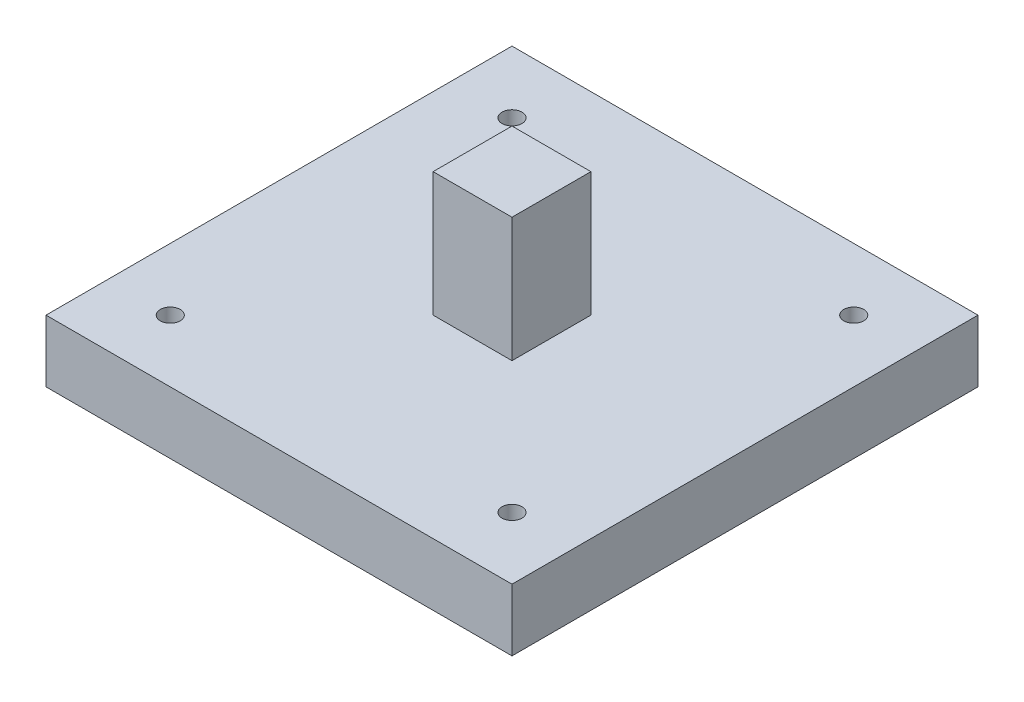
ISO-10303-21;
HEADER;
FILE_DESCRIPTION(('STEP AP214'),'2;1');
FILE_NAME('part.step','',(''),(''),'','','');
FILE_SCHEMA(('AUTOMOTIVE_DESIGN { 1 0 10303 214 1 1 1 1 }'));
ENDSEC;
DATA;
#1=APPLICATION_CONTEXT('core data for automotive mechanical design processes');
#2=APPLICATION_PROTOCOL_DEFINITION('international standard','automotive_design',2000,#1);
#3=PRODUCT_CONTEXT('',#1,'mechanical');
#4=PRODUCT('Part','Part','',(#3));
#5=PRODUCT_RELATED_PRODUCT_CATEGORY('part','',(#4));
#6=PRODUCT_DEFINITION_FORMATION('','',#4);
#7=PRODUCT_DEFINITION_CONTEXT('part definition',#1,'design');
#8=PRODUCT_DEFINITION('design','',#6,#7);
#9=PRODUCT_DEFINITION_SHAPE('','',#8);
#10=(LENGTH_UNIT() NAMED_UNIT(*) SI_UNIT(.MILLI.,.METRE.));
#11=(NAMED_UNIT(*) PLANE_ANGLE_UNIT() SI_UNIT($,.RADIAN.));
#12=(NAMED_UNIT(*) SI_UNIT($,.STERADIAN.) SOLID_ANGLE_UNIT());
#13=UNCERTAINTY_MEASURE_WITH_UNIT(LENGTH_MEASURE(1.E-05),#10,'distance_accuracy_value','');
#14=(GEOMETRIC_REPRESENTATION_CONTEXT(3) GLOBAL_UNCERTAINTY_ASSIGNED_CONTEXT((#13)) GLOBAL_UNIT_ASSIGNED_CONTEXT((#10,
#11,#12)) REPRESENTATION_CONTEXT('',''));
#15=CARTESIAN_POINT('',(0.,0.,0.));
#16=DIRECTION('',(0.,0.,1.));
#17=DIRECTION('',(1.,0.,0.));
#18=AXIS2_PLACEMENT_3D('',#15,#16,#17);
#19=CARTESIAN_POINT('',(0.,10.,0.));
#20=DIRECTION('',(0.,1.,0.));
#21=DIRECTION('',(0.,0.,1.));
#22=AXIS2_PLACEMENT_3D('',#19,#20,#21);
#23=PLANE('',#22);
#24=CARTESIAN_POINT('',(29.7613065326633,10.,-19.2085427135678));
#25=DIRECTION('',(0.,1.,0.));
#26=DIRECTION('',(0.,0.,1.));
#27=AXIS2_PLACEMENT_3D('',#24,#25,#26);
#28=CIRCLE('',#27,1.6);
#29=CARTESIAN_POINT('',(29.7613065326633,10.,-17.6085427135679));
#30=VERTEX_POINT('',#29);
#31=EDGE_CURVE('E151',#30,#30,#28,.T.);
#32=ORIENTED_EDGE('',*,*,#31,.F.);
#33=EDGE_LOOP('',(#32));
#34=FACE_BOUND('',#33,.T.);
#35=CARTESIAN_POINT('',(-25.2386934673367,10.,35.7914572864321));
#36=DIRECTION('',(0.,1.,0.));
#37=DIRECTION('',(0.,0.,1.));
#38=AXIS2_PLACEMENT_3D('',#35,#36,#37);
#39=CIRCLE('',#38,1.6);
#40=CARTESIAN_POINT('',(-25.2386934673367,10.,37.3914572864321));
#41=VERTEX_POINT('',#40);
#42=EDGE_CURVE('E160',#41,#41,#39,.T.);
#43=ORIENTED_EDGE('',*,*,#42,.F.);
#44=EDGE_LOOP('',(#43));
#45=FACE_BOUND('',#44,.T.);
#46=CARTESIAN_POINT('',(29.7613065326633,10.,35.7914572864321));
#47=DIRECTION('',(0.,1.,0.));
#48=DIRECTION('',(0.,0.,1.));
#49=AXIS2_PLACEMENT_3D('',#46,#47,#48);
#50=CIRCLE('',#49,1.6);
#51=CARTESIAN_POINT('',(29.7613065326633,10.,37.3914572864321));
#52=VERTEX_POINT('',#51);
#53=EDGE_CURVE('E141',#52,#52,#50,.T.);
#54=ORIENTED_EDGE('',*,*,#53,.F.);
#55=EDGE_LOOP('',(#54));
#56=FACE_BOUND('',#55,.T.);
#57=CARTESIAN_POINT('',(-25.2386934673367,10.,-19.2085427135678));
#58=DIRECTION('',(0.,1.,0.));
#59=DIRECTION('',(0.,0.,1.));
#60=AXIS2_PLACEMENT_3D('',#57,#58,#59);
#61=CIRCLE('',#60,1.6);
#62=CARTESIAN_POINT('',(-25.2386934673367,10.,-17.6085427135678));
#63=VERTEX_POINT('',#62);
#64=EDGE_CURVE('E155',#63,#63,#61,.T.);
#65=ORIENTED_EDGE('',*,*,#64,.F.);
#66=EDGE_LOOP('',(#65));
#67=FACE_BOUND('',#66,.T.);
#68=DIRECTION('',(0.,0.,1.));
#69=VECTOR('',#68,1.);
#70=CARTESIAN_POINT('',(-35.2386934673367,10.,-29.2085427135678));
#71=LINE('',#70,#69);
#72=CARTESIAN_POINT('',(-35.2386934673367,10.,-29.2085427135678));
#73=VERTEX_POINT('',#72);
#74=CARTESIAN_POINT('',(-35.2386934673367,10.,45.7914572864321));
#75=VERTEX_POINT('',#74);
#76=EDGE_CURVE('E175',#73,#75,#71,.T.);
#77=ORIENTED_EDGE('',*,*,#76,.T.);
#78=DIRECTION('',(1.,0.,0.));
#79=VECTOR('',#78,1.);
#80=CARTESIAN_POINT('',(-35.2386934673367,10.,45.7914572864321));
#81=LINE('',#80,#79);
#82=CARTESIAN_POINT('',(39.7613065326633,10.,45.7914572864321));
#83=VERTEX_POINT('',#82);
#84=EDGE_CURVE('E179',#75,#83,#81,.T.);
#85=ORIENTED_EDGE('',*,*,#84,.T.);
#86=DIRECTION('',(0.,0.,-1.));
#87=VECTOR('',#86,1.);
#88=CARTESIAN_POINT('',(39.7613065326633,10.,-29.2085427135678));
#89=LINE('',#88,#87);
#90=CARTESIAN_POINT('',(39.7613065326633,10.,-29.2085427135678));
#91=VERTEX_POINT('',#90);
#92=EDGE_CURVE('E183',#83,#91,#89,.T.);
#93=ORIENTED_EDGE('',*,*,#92,.T.);
#94=DIRECTION('',(-1.,0.,0.));
#95=VECTOR('',#94,1.);
#96=CARTESIAN_POINT('',(-35.2386934673367,10.,-29.2085427135678));
#97=LINE('',#96,#95);
#98=EDGE_CURVE('E186',#91,#73,#97,.T.);
#99=ORIENTED_EDGE('',*,*,#98,.T.);
#100=EDGE_LOOP('',(#77,#85,#93,#99));
#101=FACE_BOUND('',#100,.T.);
#102=DIRECTION('',(1.,0.,0.));
#103=VECTOR('',#102,1.);
#104=CARTESIAN_POINT('',(-4.08869346733667,10.,14.6414572864321));
#105=LINE('',#104,#103);
#106=CARTESIAN_POINT('',(-4.08869346733667,10.,14.6414572864321));
#107=VERTEX_POINT('',#106);
#108=CARTESIAN_POINT('',(8.61130653266333,10.,14.6414572864321));
#109=VERTEX_POINT('',#108);
#110=EDGE_CURVE('E61',#107,#109,#105,.T.);
#111=ORIENTED_EDGE('',*,*,#110,.F.);
#112=DIRECTION('',(0.,0.,1.));
#113=VECTOR('',#112,1.);
#114=CARTESIAN_POINT('',(-4.08869346733667,10.,1.94145728643215));
#115=LINE('',#114,#113);
#116=CARTESIAN_POINT('',(-4.08869346733667,10.,1.94145728643215));
#117=VERTEX_POINT('',#116);
#118=EDGE_CURVE('E134',#117,#107,#115,.T.);
#119=ORIENTED_EDGE('',*,*,#118,.F.);
#120=DIRECTION('',(1.,0.,0.));
#121=VECTOR('',#120,1.);
#122=CARTESIAN_POINT('',(-4.08869346733667,10.,1.94145728643215));
#123=LINE('',#122,#121);
#124=CARTESIAN_POINT('',(8.61130653266333,10.,1.94145728643215));
#125=VERTEX_POINT('',#124);
#126=EDGE_CURVE('E131',#117,#125,#123,.T.);
#127=ORIENTED_EDGE('',*,*,#126,.T.);
#128=DIRECTION('',(0.,0.,1.));
#129=VECTOR('',#128,1.);
#130=CARTESIAN_POINT('',(8.61130653266333,10.,1.94145728643215));
#131=LINE('',#130,#129);
#132=EDGE_CURVE('E66',#125,#109,#131,.T.);
#133=ORIENTED_EDGE('',*,*,#132,.T.);
#134=EDGE_LOOP('',(#111,#119,#127,#133));
#135=FACE_BOUND('',#134,.T.);
#136=ADVANCED_FACE('F45',(#34,#45,#56,#67,#101,#135),#23,.T.);
#137=CARTESIAN_POINT('',(-35.2386934673367,10.,-29.2085427135678));
#138=DIRECTION('',(1.,0.,0.));
#139=DIRECTION('',(0.,0.,-1.));
#140=AXIS2_PLACEMENT_3D('',#137,#138,#139);
#141=PLANE('',#140);
#142=DIRECTION('',(0.,0.,1.));
#143=VECTOR('',#142,1.);
#144=CARTESIAN_POINT('',(-35.2386934673367,0.,-29.2085427135678));
#145=LINE('',#144,#143);
#146=CARTESIAN_POINT('',(-35.2386934673367,0.,-29.2085427135678));
#147=VERTEX_POINT('',#146);
#148=CARTESIAN_POINT('',(-35.2386934673367,0.,45.7914572864321));
#149=VERTEX_POINT('',#148);
#150=EDGE_CURVE('E171',#147,#149,#145,.T.);
#151=ORIENTED_EDGE('',*,*,#150,.T.);
#152=DIRECTION('',(0.,-1.,0.));
#153=VECTOR('',#152,1.);
#154=CARTESIAN_POINT('',(-35.2386934673367,10.,45.7914572864321));
#155=LINE('',#154,#153);
#156=EDGE_CURVE('E11',#75,#149,#155,.T.);
#157=ORIENTED_EDGE('',*,*,#156,.F.);
#158=ORIENTED_EDGE('',*,*,#76,.F.);
#159=DIRECTION('',(0.,-1.,0.));
#160=VECTOR('',#159,1.);
#161=CARTESIAN_POINT('',(-35.2386934673367,10.,-29.2085427135678));
#162=LINE('',#161,#160);
#163=EDGE_CURVE('E189',#73,#147,#162,.T.);
#164=ORIENTED_EDGE('',*,*,#163,.T.);
#165=EDGE_LOOP('',(#151,#157,#158,#164));
#166=FACE_BOUND('',#165,.T.);
#167=ADVANCED_FACE('F47',(#166),#141,.F.);
#168=CARTESIAN_POINT('',(-35.2386934673367,10.,45.7914572864321));
#169=DIRECTION('',(0.,0.,-1.));
#170=DIRECTION('',(-1.,0.,0.));
#171=AXIS2_PLACEMENT_3D('',#168,#169,#170);
#172=PLANE('',#171);
#173=DIRECTION('',(1.,0.,0.));
#174=VECTOR('',#173,1.);
#175=CARTESIAN_POINT('',(-35.2386934673367,0.,45.7914572864321));
#176=LINE('',#175,#174);
#177=CARTESIAN_POINT('',(39.7613065326633,0.,45.7914572864321));
#178=VERTEX_POINT('',#177);
#179=EDGE_CURVE('E193',#149,#178,#176,.T.);
#180=ORIENTED_EDGE('',*,*,#179,.T.);
#181=DIRECTION('',(0.,-1.,0.));
#182=VECTOR('',#181,1.);
#183=CARTESIAN_POINT('',(39.7613065326633,10.,45.7914572864321));
#184=LINE('',#183,#182);
#185=EDGE_CURVE('E54',#83,#178,#184,.T.);
#186=ORIENTED_EDGE('',*,*,#185,.F.);
#187=ORIENTED_EDGE('',*,*,#84,.F.);
#188=ORIENTED_EDGE('',*,*,#156,.T.);
#189=EDGE_LOOP('',(#180,#186,#187,#188));
#190=FACE_BOUND('',#189,.T.);
#191=ADVANCED_FACE('F228',(#190),#172,.F.);
#192=CARTESIAN_POINT('',(39.7613065326633,10.,-29.2085427135678));
#193=DIRECTION('',(-1.,0.,0.));
#194=DIRECTION('',(0.,0.,1.));
#195=AXIS2_PLACEMENT_3D('',#192,#193,#194);
#196=PLANE('',#195);
#197=DIRECTION('',(0.,0.,-1.));
#198=VECTOR('',#197,1.);
#199=CARTESIAN_POINT('',(39.7613065326633,0.,-29.2085427135678));
#200=LINE('',#199,#198);
#201=CARTESIAN_POINT('',(39.7613065326633,0.,-29.2085427135678));
#202=VERTEX_POINT('',#201);
#203=EDGE_CURVE('E196',#178,#202,#200,.T.);
#204=ORIENTED_EDGE('',*,*,#203,.T.);
#205=DIRECTION('',(0.,-1.,0.));
#206=VECTOR('',#205,1.);
#207=CARTESIAN_POINT('',(39.7613065326633,10.,-29.2085427135678));
#208=LINE('',#207,#206);
#209=EDGE_CURVE('E204',#91,#202,#208,.T.);
#210=ORIENTED_EDGE('',*,*,#209,.F.);
#211=ORIENTED_EDGE('',*,*,#92,.F.);
#212=ORIENTED_EDGE('',*,*,#185,.T.);
#213=EDGE_LOOP('',(#204,#210,#211,#212));
#214=FACE_BOUND('',#213,.T.);
#215=ADVANCED_FACE('F213',(#214),#196,.F.);
#216=CARTESIAN_POINT('',(-35.2386934673367,10.,-29.2085427135678));
#217=DIRECTION('',(0.,0.,1.));
#218=DIRECTION('',(1.,0.,0.));
#219=AXIS2_PLACEMENT_3D('',#216,#217,#218);
#220=PLANE('',#219);
#221=DIRECTION('',(-1.,0.,0.));
#222=VECTOR('',#221,1.);
#223=CARTESIAN_POINT('',(-35.2386934673367,0.,-29.2085427135678));
#224=LINE('',#223,#222);
#225=EDGE_CURVE('E180',#202,#147,#224,.T.);
#226=ORIENTED_EDGE('',*,*,#225,.T.);
#227=ORIENTED_EDGE('',*,*,#163,.F.);
#228=ORIENTED_EDGE('',*,*,#98,.F.);
#229=ORIENTED_EDGE('',*,*,#209,.T.);
#230=EDGE_LOOP('',(#226,#227,#228,#229));
#231=FACE_BOUND('',#230,.T.);
#232=ADVANCED_FACE('F222',(#231),#220,.F.);
#233=CARTESIAN_POINT('',(0.,0.,0.));
#234=DIRECTION('',(0.,1.,0.));
#235=DIRECTION('',(0.,0.,1.));
#236=AXIS2_PLACEMENT_3D('',#233,#234,#235);
#237=PLANE('',#236);
#238=CARTESIAN_POINT('',(29.7613065326633,0.,-19.2085427135678));
#239=DIRECTION('',(0.,1.,0.));
#240=DIRECTION('',(0.,0.,1.));
#241=AXIS2_PLACEMENT_3D('',#238,#239,#240);
#242=CIRCLE('',#241,1.6);
#243=CARTESIAN_POINT('',(29.7613065326633,0.,-17.6085427135679));
#244=VERTEX_POINT('',#243);
#245=EDGE_CURVE('E156',#244,#244,#242,.T.);
#246=ORIENTED_EDGE('',*,*,#245,.T.);
#247=EDGE_LOOP('',(#246));
#248=FACE_BOUND('',#247,.T.);
#249=CARTESIAN_POINT('',(-25.2386934673367,0.,35.7914572864321));
#250=DIRECTION('',(0.,1.,0.));
#251=DIRECTION('',(0.,0.,1.));
#252=AXIS2_PLACEMENT_3D('',#249,#250,#251);
#253=CIRCLE('',#252,1.6);
#254=CARTESIAN_POINT('',(-25.2386934673367,0.,37.3914572864321));
#255=VERTEX_POINT('',#254);
#256=EDGE_CURVE('E149',#255,#255,#253,.T.);
#257=ORIENTED_EDGE('',*,*,#256,.T.);
#258=EDGE_LOOP('',(#257));
#259=FACE_BOUND('',#258,.T.);
#260=CARTESIAN_POINT('',(29.7613065326633,0.,35.7914572864321));
#261=DIRECTION('',(0.,1.,0.));
#262=DIRECTION('',(0.,0.,1.));
#263=AXIS2_PLACEMENT_3D('',#260,#261,#262);
#264=CIRCLE('',#263,1.6);
#265=CARTESIAN_POINT('',(29.7613065326633,0.,37.3914572864321));
#266=VERTEX_POINT('',#265);
#267=EDGE_CURVE('E136',#266,#266,#264,.T.);
#268=ORIENTED_EDGE('',*,*,#267,.T.);
#269=EDGE_LOOP('',(#268));
#270=FACE_BOUND('',#269,.T.);
#271=CARTESIAN_POINT('',(-25.2386934673367,0.,-19.2085427135678));
#272=DIRECTION('',(0.,1.,0.));
#273=DIRECTION('',(0.,0.,1.));
#274=AXIS2_PLACEMENT_3D('',#271,#272,#273);
#275=CIRCLE('',#274,1.6);
#276=CARTESIAN_POINT('',(-25.2386934673367,0.,-17.6085427135678));
#277=VERTEX_POINT('',#276);
#278=EDGE_CURVE('E167',#277,#277,#275,.T.);
#279=ORIENTED_EDGE('',*,*,#278,.T.);
#280=EDGE_LOOP('',(#279));
#281=FACE_BOUND('',#280,.T.);
#282=ORIENTED_EDGE('',*,*,#150,.F.);
#283=ORIENTED_EDGE('',*,*,#225,.F.);
#284=ORIENTED_EDGE('',*,*,#203,.F.);
#285=ORIENTED_EDGE('',*,*,#179,.F.);
#286=EDGE_LOOP('',(#282,#283,#284,#285));
#287=FACE_BOUND('',#286,.T.);
#288=ADVANCED_FACE('F219',(#248,#259,#270,#281,#287),#237,.F.);
#289=CARTESIAN_POINT('',(-25.2386934673367,0.,-19.2085427135678));
#290=DIRECTION('',(0.,1.,0.));
#291=DIRECTION('',(0.,0.,1.));
#292=AXIS2_PLACEMENT_3D('',#289,#290,#291);
#293=CYLINDRICAL_SURFACE('',#292,1.6);
#294=ORIENTED_EDGE('',*,*,#278,.F.);
#295=EDGE_LOOP('',(#294));
#296=FACE_BOUND('',#295,.T.);
#297=ORIENTED_EDGE('',*,*,#64,.T.);
#298=EDGE_LOOP('',(#297));
#299=FACE_BOUND('',#298,.T.);
#300=ADVANCED_FACE('F244',(#296,#299),#293,.F.);
#301=CARTESIAN_POINT('',(29.7613065326633,0.,35.7914572864321));
#302=DIRECTION('',(0.,1.,0.));
#303=DIRECTION('',(0.,0.,1.));
#304=AXIS2_PLACEMENT_3D('',#301,#302,#303);
#305=CYLINDRICAL_SURFACE('',#304,1.6);
#306=ORIENTED_EDGE('',*,*,#267,.F.);
#307=EDGE_LOOP('',(#306));
#308=FACE_BOUND('',#307,.T.);
#309=ORIENTED_EDGE('',*,*,#53,.T.);
#310=EDGE_LOOP('',(#309));
#311=FACE_BOUND('',#310,.T.);
#312=ADVANCED_FACE('F264',(#308,#311),#305,.F.);
#313=CARTESIAN_POINT('',(-25.2386934673367,0.,35.7914572864321));
#314=DIRECTION('',(0.,1.,0.));
#315=DIRECTION('',(0.,0.,1.));
#316=AXIS2_PLACEMENT_3D('',#313,#314,#315);
#317=CYLINDRICAL_SURFACE('',#316,1.6);
#318=ORIENTED_EDGE('',*,*,#256,.F.);
#319=EDGE_LOOP('',(#318));
#320=FACE_BOUND('',#319,.T.);
#321=ORIENTED_EDGE('',*,*,#42,.T.);
#322=EDGE_LOOP('',(#321));
#323=FACE_BOUND('',#322,.T.);
#324=ADVANCED_FACE('F271',(#320,#323),#317,.F.);
#325=CARTESIAN_POINT('',(29.7613065326633,0.,-19.2085427135678));
#326=DIRECTION('',(0.,1.,0.));
#327=DIRECTION('',(0.,0.,1.));
#328=AXIS2_PLACEMENT_3D('',#325,#326,#327);
#329=CYLINDRICAL_SURFACE('',#328,1.6);
#330=ORIENTED_EDGE('',*,*,#245,.F.);
#331=EDGE_LOOP('',(#330));
#332=FACE_BOUND('',#331,.T.);
#333=ORIENTED_EDGE('',*,*,#31,.T.);
#334=EDGE_LOOP('',(#333));
#335=FACE_BOUND('',#334,.T.);
#336=ADVANCED_FACE('F279',(#332,#335),#329,.F.);
#337=CARTESIAN_POINT('',(-4.08869346733667,30.,1.94145728643215));
#338=DIRECTION('',(1.,0.,0.));
#339=DIRECTION('',(0.,0.,-1.));
#340=AXIS2_PLACEMENT_3D('',#337,#338,#339);
#341=PLANE('',#340);
#342=ORIENTED_EDGE('',*,*,#118,.T.);
#343=DIRECTION('',(0.,-1.,0.));
#344=VECTOR('',#343,1.);
#345=CARTESIAN_POINT('',(-4.08869346733667,30.,14.6414572864321));
#346=LINE('',#345,#344);
#347=CARTESIAN_POINT('',(-4.08869346733667,30.,14.6414572864321));
#348=VERTEX_POINT('',#347);
#349=EDGE_CURVE('E113',#348,#107,#346,.T.);
#350=ORIENTED_EDGE('',*,*,#349,.F.);
#351=DIRECTION('',(0.,0.,1.));
#352=VECTOR('',#351,1.);
#353=CARTESIAN_POINT('',(-4.08869346733667,30.,1.94145728643215));
#354=LINE('',#353,#352);
#355=CARTESIAN_POINT('',(-4.08869346733667,30.,1.94145728643215));
#356=VERTEX_POINT('',#355);
#357=EDGE_CURVE('E121',#356,#348,#354,.T.);
#358=ORIENTED_EDGE('',*,*,#357,.F.);
#359=DIRECTION('',(0.,-1.,0.));
#360=VECTOR('',#359,1.);
#361=CARTESIAN_POINT('',(-4.08869346733667,30.,1.94145728643215));
#362=LINE('',#361,#360);
#363=EDGE_CURVE('E425',#356,#117,#362,.T.);
#364=ORIENTED_EDGE('',*,*,#363,.T.);
#365=EDGE_LOOP('',(#342,#350,#358,#364));
#366=FACE_BOUND('',#365,.T.);
#367=ADVANCED_FACE('F133',(#366),#341,.F.);
#368=CARTESIAN_POINT('',(-4.08869346733667,30.,14.6414572864321));
#369=DIRECTION('',(0.,0.,-1.));
#370=DIRECTION('',(-1.,0.,0.));
#371=AXIS2_PLACEMENT_3D('',#368,#369,#370);
#372=PLANE('',#371);
#373=ORIENTED_EDGE('',*,*,#110,.T.);
#374=DIRECTION('',(0.,-1.,0.));
#375=VECTOR('',#374,1.);
#376=CARTESIAN_POINT('',(8.61130653266333,30.,14.6414572864321));
#377=LINE('',#376,#375);
#378=CARTESIAN_POINT('',(8.61130653266333,30.,14.6414572864321));
#379=VERTEX_POINT('',#378);
#380=EDGE_CURVE('E115',#379,#109,#377,.T.);
#381=ORIENTED_EDGE('',*,*,#380,.F.);
#382=DIRECTION('',(1.,0.,0.));
#383=VECTOR('',#382,1.);
#384=CARTESIAN_POINT('',(-4.08869346733667,30.,14.6414572864321));
#385=LINE('',#384,#383);
#386=EDGE_CURVE('E109',#348,#379,#385,.T.);
#387=ORIENTED_EDGE('',*,*,#386,.F.);
#388=ORIENTED_EDGE('',*,*,#349,.T.);
#389=EDGE_LOOP('',(#373,#381,#387,#388));
#390=FACE_BOUND('',#389,.T.);
#391=ADVANCED_FACE('F111',(#390),#372,.F.);
#392=CARTESIAN_POINT('',(8.61130653266333,30.,1.94145728643215));
#393=DIRECTION('',(1.,0.,0.));
#394=DIRECTION('',(0.,0.,-1.));
#395=AXIS2_PLACEMENT_3D('',#392,#393,#394);
#396=PLANE('',#395);
#397=ORIENTED_EDGE('',*,*,#132,.F.);
#398=DIRECTION('',(0.,-1.,0.));
#399=VECTOR('',#398,1.);
#400=CARTESIAN_POINT('',(8.61130653266333,30.,1.94145728643215));
#401=LINE('',#400,#399);
#402=CARTESIAN_POINT('',(8.61130653266333,30.,1.94145728643215));
#403=VERTEX_POINT('',#402);
#404=EDGE_CURVE('E143',#403,#125,#401,.T.);
#405=ORIENTED_EDGE('',*,*,#404,.F.);
#406=DIRECTION('',(0.,0.,1.));
#407=VECTOR('',#406,1.);
#408=CARTESIAN_POINT('',(8.61130653266333,30.,1.94145728643215));
#409=LINE('',#408,#407);
#410=EDGE_CURVE('E120',#403,#379,#409,.T.);
#411=ORIENTED_EDGE('',*,*,#410,.T.);
#412=ORIENTED_EDGE('',*,*,#380,.T.);
#413=EDGE_LOOP('',(#397,#405,#411,#412));
#414=FACE_BOUND('',#413,.T.);
#415=ADVANCED_FACE('F299',(#414),#396,.T.);
#416=CARTESIAN_POINT('',(-4.08869346733667,30.,1.94145728643215));
#417=DIRECTION('',(0.,0.,-1.));
#418=DIRECTION('',(-1.,0.,0.));
#419=AXIS2_PLACEMENT_3D('',#416,#417,#418);
#420=PLANE('',#419);
#421=ORIENTED_EDGE('',*,*,#126,.F.);
#422=ORIENTED_EDGE('',*,*,#363,.F.);
#423=DIRECTION('',(1.,0.,0.));
#424=VECTOR('',#423,1.);
#425=CARTESIAN_POINT('',(-4.08869346733667,30.,1.94145728643215));
#426=LINE('',#425,#424);
#427=EDGE_CURVE('E127',#356,#403,#426,.T.);
#428=ORIENTED_EDGE('',*,*,#427,.T.);
#429=ORIENTED_EDGE('',*,*,#404,.T.);
#430=EDGE_LOOP('',(#421,#422,#428,#429));
#431=FACE_BOUND('',#430,.T.);
#432=ADVANCED_FACE('F306',(#431),#420,.T.);
#433=CARTESIAN_POINT('',(0.,30.,0.));
#434=DIRECTION('',(0.,1.,0.));
#435=DIRECTION('',(0.,0.,1.));
#436=AXIS2_PLACEMENT_3D('',#433,#434,#435);
#437=PLANE('',#436);
#438=ORIENTED_EDGE('',*,*,#357,.T.);
#439=ORIENTED_EDGE('',*,*,#386,.T.);
#440=ORIENTED_EDGE('',*,*,#410,.F.);
#441=ORIENTED_EDGE('',*,*,#427,.F.);
#442=EDGE_LOOP('',(#438,#439,#440,#441));
#443=FACE_BOUND('',#442,.T.);
#444=ADVANCED_FACE('F125',(#443),#437,.T.);
#445=CLOSED_SHELL('',(#136,#167,#191,#215,#232,#288,#300,#312,#324,#336,#367,#391,#415,#432,#444));
#446=MANIFOLD_SOLID_BREP('B2',#445);
#447=ADVANCED_BREP_SHAPE_REPRESENTATION('',(#18,#446),#14);
#448=SHAPE_DEFINITION_REPRESENTATION(#9,#447);
ENDSEC;
END-ISO-10303-21;
